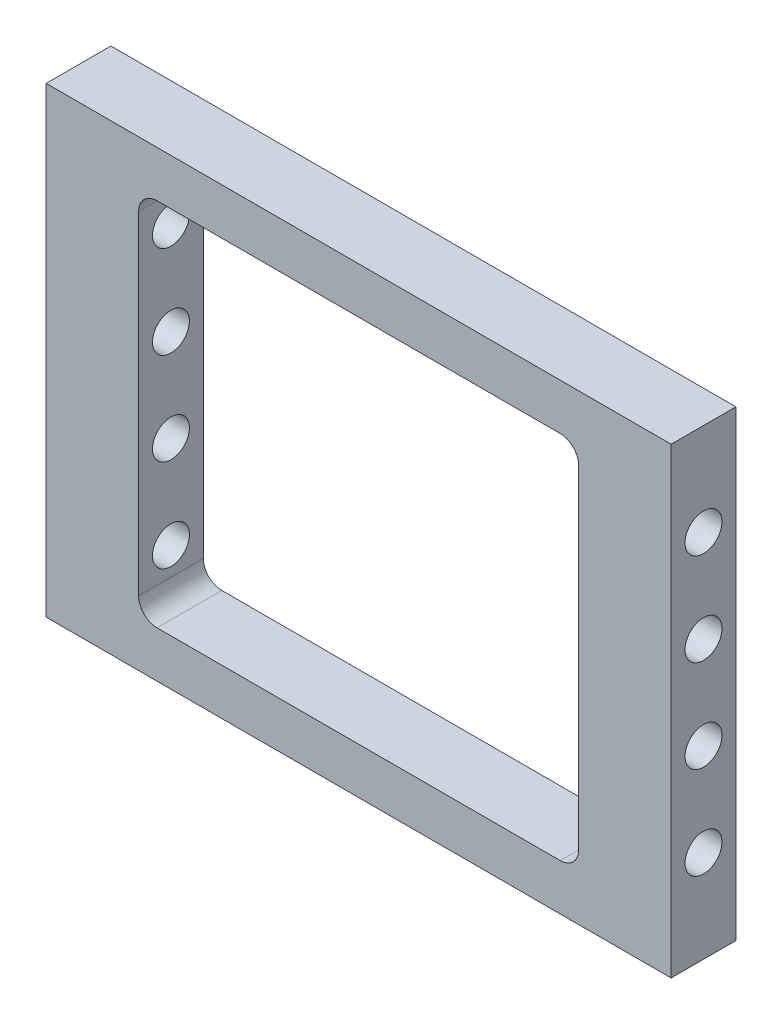
ISO-10303-21;
HEADER;
FILE_DESCRIPTION(('STEP AP214'),'2;1');
FILE_NAME('part.step','',(''),(''),'','','');
FILE_SCHEMA(('AUTOMOTIVE_DESIGN { 1 0 10303 214 1 1 1 1 }'));
ENDSEC;
DATA;
#1=APPLICATION_CONTEXT('core data for automotive mechanical design processes');
#2=APPLICATION_PROTOCOL_DEFINITION('international standard','automotive_design',2000,#1);
#3=PRODUCT_CONTEXT('',#1,'mechanical');
#4=PRODUCT('Part','Part','',(#3));
#5=PRODUCT_RELATED_PRODUCT_CATEGORY('part','',(#4));
#6=PRODUCT_DEFINITION_FORMATION('','',#4);
#7=PRODUCT_DEFINITION_CONTEXT('part definition',#1,'design');
#8=PRODUCT_DEFINITION('design','',#6,#7);
#9=PRODUCT_DEFINITION_SHAPE('','',#8);
#10=(LENGTH_UNIT() NAMED_UNIT(*) SI_UNIT(.MILLI.,.METRE.));
#11=(NAMED_UNIT(*) PLANE_ANGLE_UNIT() SI_UNIT($,.RADIAN.));
#12=(NAMED_UNIT(*) SI_UNIT($,.STERADIAN.) SOLID_ANGLE_UNIT());
#13=UNCERTAINTY_MEASURE_WITH_UNIT(LENGTH_MEASURE(1.E-05),#10,'distance_accuracy_value','');
#14=(GEOMETRIC_REPRESENTATION_CONTEXT(3) GLOBAL_UNCERTAINTY_ASSIGNED_CONTEXT((#13)) GLOBAL_UNIT_ASSIGNED_CONTEXT((#10,
#11,#12)) REPRESENTATION_CONTEXT('',''));
#15=CARTESIAN_POINT('',(0.,0.,0.));
#16=DIRECTION('',(0.,0.,1.));
#17=DIRECTION('',(1.,0.,0.));
#18=AXIS2_PLACEMENT_3D('',#15,#16,#17);
#19=CARTESIAN_POINT('',(0.,0.,7.));
#20=DIRECTION('',(1.,0.,0.));
#21=DIRECTION('',(0.,0.,-1.));
#22=AXIS2_PLACEMENT_3D('',#19,#20,#21);
#23=PLANE('',#22);
#24=CARTESIAN_POINT('',(0.,30.,3.5));
#25=DIRECTION('',(-1.,0.,0.));
#26=DIRECTION('',(0.,0.,1.));
#27=AXIS2_PLACEMENT_3D('',#24,#25,#26);
#28=CIRCLE('',#27,2.);
#29=CARTESIAN_POINT('',(0.,30.,5.5));
#30=VERTEX_POINT('',#29);
#31=EDGE_CURVE('E256',#30,#30,#28,.T.);
#32=ORIENTED_EDGE('',*,*,#31,.F.);
#33=EDGE_LOOP('',(#32));
#34=FACE_BOUND('',#33,.T.);
#35=CARTESIAN_POINT('',(0.,20.,3.5));
#36=DIRECTION('',(-1.,0.,0.));
#37=DIRECTION('',(0.,0.,1.));
#38=AXIS2_PLACEMENT_3D('',#35,#36,#37);
#39=CIRCLE('',#38,2.);
#40=CARTESIAN_POINT('',(0.,20.,5.5));
#41=VERTEX_POINT('',#40);
#42=EDGE_CURVE('E260',#41,#41,#39,.T.);
#43=ORIENTED_EDGE('',*,*,#42,.F.);
#44=EDGE_LOOP('',(#43));
#45=FACE_BOUND('',#44,.T.);
#46=CARTESIAN_POINT('',(0.,10.,3.5));
#47=DIRECTION('',(-1.,0.,0.));
#48=DIRECTION('',(0.,0.,1.));
#49=AXIS2_PLACEMENT_3D('',#46,#47,#48);
#50=CIRCLE('',#49,2.);
#51=CARTESIAN_POINT('',(0.,10.,5.5));
#52=VERTEX_POINT('',#51);
#53=EDGE_CURVE('E255',#52,#52,#50,.T.);
#54=ORIENTED_EDGE('',*,*,#53,.F.);
#55=EDGE_LOOP('',(#54));
#56=FACE_BOUND('',#55,.T.);
#57=CARTESIAN_POINT('',(0.,40.,3.5));
#58=DIRECTION('',(-1.,0.,0.));
#59=DIRECTION('',(0.,0.,1.));
#60=AXIS2_PLACEMENT_3D('',#57,#58,#59);
#61=CIRCLE('',#60,2.);
#62=CARTESIAN_POINT('',(0.,40.,5.5));
#63=VERTEX_POINT('',#62);
#64=EDGE_CURVE('E259',#63,#63,#61,.T.);
#65=ORIENTED_EDGE('',*,*,#64,.F.);
#66=EDGE_LOOP('',(#65));
#67=FACE_BOUND('',#66,.T.);
#68=DIRECTION('',(0.,-1.,0.));
#69=VECTOR('',#68,1.);
#70=CARTESIAN_POINT('',(0.,0.,0.));
#71=LINE('',#70,#69);
#72=CARTESIAN_POINT('',(0.,50.,0.));
#73=VERTEX_POINT('',#72);
#74=CARTESIAN_POINT('',(0.,0.,0.));
#75=VERTEX_POINT('',#74);
#76=EDGE_CURVE('E147',#73,#75,#71,.T.);
#77=ORIENTED_EDGE('',*,*,#76,.T.);
#78=DIRECTION('',(0.,0.,-1.));
#79=VECTOR('',#78,1.);
#80=CARTESIAN_POINT('',(0.,0.,7.));
#81=LINE('',#80,#79);
#82=CARTESIAN_POINT('',(0.,0.,7.));
#83=VERTEX_POINT('',#82);
#84=EDGE_CURVE('E128',#83,#75,#81,.T.);
#85=ORIENTED_EDGE('',*,*,#84,.F.);
#86=DIRECTION('',(0.,-1.,0.));
#87=VECTOR('',#86,1.);
#88=CARTESIAN_POINT('',(0.,0.,7.));
#89=LINE('',#88,#87);
#90=CARTESIAN_POINT('',(0.,50.,7.));
#91=VERTEX_POINT('',#90);
#92=EDGE_CURVE('E135',#91,#83,#89,.T.);
#93=ORIENTED_EDGE('',*,*,#92,.F.);
#94=DIRECTION('',(0.,0.,-1.));
#95=VECTOR('',#94,1.);
#96=CARTESIAN_POINT('',(0.,50.,7.));
#97=LINE('',#96,#95);
#98=EDGE_CURVE('E269',#91,#73,#97,.T.);
#99=ORIENTED_EDGE('',*,*,#98,.T.);
#100=EDGE_LOOP('',(#77,#85,#93,#99));
#101=FACE_BOUND('',#100,.T.);
#102=ADVANCED_FACE('F35',(#34,#45,#56,#67,#101),#23,.F.);
#103=CARTESIAN_POINT('',(0.,0.,7.));
#104=DIRECTION('',(0.,1.,0.));
#105=DIRECTION('',(0.,0.,1.));
#106=AXIS2_PLACEMENT_3D('',#103,#104,#105);
#107=PLANE('',#106);
#108=DIRECTION('',(1.,0.,0.));
#109=VECTOR('',#108,1.);
#110=CARTESIAN_POINT('',(0.,0.,0.));
#111=LINE('',#110,#109);
#112=CARTESIAN_POINT('',(67.6,0.,0.));
#113=VERTEX_POINT('',#112);
#114=EDGE_CURVE('E271',#75,#113,#111,.T.);
#115=ORIENTED_EDGE('',*,*,#114,.T.);
#116=DIRECTION('',(0.,0.,-1.));
#117=VECTOR('',#116,1.);
#118=CARTESIAN_POINT('',(67.6,0.,7.));
#119=LINE('',#118,#117);
#120=CARTESIAN_POINT('',(67.6,0.,7.));
#121=VERTEX_POINT('',#120);
#122=EDGE_CURVE('E131',#121,#113,#119,.T.);
#123=ORIENTED_EDGE('',*,*,#122,.F.);
#124=DIRECTION('',(1.,0.,0.));
#125=VECTOR('',#124,1.);
#126=CARTESIAN_POINT('',(0.,0.,7.));
#127=LINE('',#126,#125);
#128=EDGE_CURVE('E124',#83,#121,#127,.T.);
#129=ORIENTED_EDGE('',*,*,#128,.F.);
#130=ORIENTED_EDGE('',*,*,#84,.T.);
#131=EDGE_LOOP('',(#115,#123,#129,#130));
#132=FACE_BOUND('',#131,.T.);
#133=ADVANCED_FACE('F126',(#132),#107,.F.);
#134=CARTESIAN_POINT('',(67.6,0.,7.));
#135=DIRECTION('',(-1.,0.,0.));
#136=DIRECTION('',(0.,0.,1.));
#137=AXIS2_PLACEMENT_3D('',#134,#135,#136);
#138=PLANE('',#137);
#139=CARTESIAN_POINT('',(67.6,30.,3.5));
#140=DIRECTION('',(-1.,0.,0.));
#141=DIRECTION('',(0.,0.,1.));
#142=AXIS2_PLACEMENT_3D('',#139,#140,#141);
#143=CIRCLE('',#142,2.);
#144=CARTESIAN_POINT('',(67.6,30.,5.5));
#145=VERTEX_POINT('',#144);
#146=EDGE_CURVE('E244',#145,#145,#143,.T.);
#147=ORIENTED_EDGE('',*,*,#146,.T.);
#148=EDGE_LOOP('',(#147));
#149=FACE_BOUND('',#148,.T.);
#150=CARTESIAN_POINT('',(67.6,20.,3.5));
#151=DIRECTION('',(-1.,0.,0.));
#152=DIRECTION('',(0.,0.,1.));
#153=AXIS2_PLACEMENT_3D('',#150,#151,#152);
#154=CIRCLE('',#153,2.);
#155=CARTESIAN_POINT('',(67.6,20.,5.5));
#156=VERTEX_POINT('',#155);
#157=EDGE_CURVE('E248',#156,#156,#154,.T.);
#158=ORIENTED_EDGE('',*,*,#157,.T.);
#159=EDGE_LOOP('',(#158));
#160=FACE_BOUND('',#159,.T.);
#161=CARTESIAN_POINT('',(67.6,10.,3.5));
#162=DIRECTION('',(-1.,0.,0.));
#163=DIRECTION('',(0.,0.,1.));
#164=AXIS2_PLACEMENT_3D('',#161,#162,#163);
#165=CIRCLE('',#164,2.);
#166=CARTESIAN_POINT('',(67.6,10.,5.5));
#167=VERTEX_POINT('',#166);
#168=EDGE_CURVE('E243',#167,#167,#165,.T.);
#169=ORIENTED_EDGE('',*,*,#168,.T.);
#170=EDGE_LOOP('',(#169));
#171=FACE_BOUND('',#170,.T.);
#172=CARTESIAN_POINT('',(67.6,40.,3.5));
#173=DIRECTION('',(-1.,0.,0.));
#174=DIRECTION('',(0.,0.,1.));
#175=AXIS2_PLACEMENT_3D('',#172,#173,#174);
#176=CIRCLE('',#175,2.);
#177=CARTESIAN_POINT('',(67.6,40.,5.5));
#178=VERTEX_POINT('',#177);
#179=EDGE_CURVE('E247',#178,#178,#176,.T.);
#180=ORIENTED_EDGE('',*,*,#179,.T.);
#181=EDGE_LOOP('',(#180));
#182=FACE_BOUND('',#181,.T.);
#183=DIRECTION('',(0.,1.,0.));
#184=VECTOR('',#183,1.);
#185=CARTESIAN_POINT('',(67.6,0.,0.));
#186=LINE('',#185,#184);
#187=CARTESIAN_POINT('',(67.6,50.,0.));
#188=VERTEX_POINT('',#187);
#189=EDGE_CURVE('E273',#113,#188,#186,.T.);
#190=ORIENTED_EDGE('',*,*,#189,.T.);
#191=DIRECTION('',(0.,0.,-1.));
#192=VECTOR('',#191,1.);
#193=CARTESIAN_POINT('',(67.6,50.,7.));
#194=LINE('',#193,#192);
#195=CARTESIAN_POINT('',(67.6,50.,7.));
#196=VERTEX_POINT('',#195);
#197=EDGE_CURVE('E152',#196,#188,#194,.T.);
#198=ORIENTED_EDGE('',*,*,#197,.F.);
#199=DIRECTION('',(0.,1.,0.));
#200=VECTOR('',#199,1.);
#201=CARTESIAN_POINT('',(67.6,0.,7.));
#202=LINE('',#201,#200);
#203=EDGE_CURVE('E134',#121,#196,#202,.T.);
#204=ORIENTED_EDGE('',*,*,#203,.F.);
#205=ORIENTED_EDGE('',*,*,#122,.T.);
#206=EDGE_LOOP('',(#190,#198,#204,#205));
#207=FACE_BOUND('',#206,.T.);
#208=ADVANCED_FACE('F285',(#149,#160,#171,#182,#207),#138,.F.);
#209=CARTESIAN_POINT('',(0.,50.,7.));
#210=DIRECTION('',(0.,-1.,0.));
#211=DIRECTION('',(0.,0.,-1.));
#212=AXIS2_PLACEMENT_3D('',#209,#210,#211);
#213=PLANE('',#212);
#214=DIRECTION('',(-1.,0.,0.));
#215=VECTOR('',#214,1.);
#216=CARTESIAN_POINT('',(0.,50.,0.));
#217=LINE('',#216,#215);
#218=EDGE_CURVE('E144',#188,#73,#217,.T.);
#219=ORIENTED_EDGE('',*,*,#218,.T.);
#220=ORIENTED_EDGE('',*,*,#98,.F.);
#221=DIRECTION('',(-1.,0.,0.));
#222=VECTOR('',#221,1.);
#223=CARTESIAN_POINT('',(0.,50.,7.));
#224=LINE('',#223,#222);
#225=EDGE_CURVE('E140',#196,#91,#224,.T.);
#226=ORIENTED_EDGE('',*,*,#225,.F.);
#227=ORIENTED_EDGE('',*,*,#197,.T.);
#228=EDGE_LOOP('',(#219,#220,#226,#227));
#229=FACE_BOUND('',#228,.T.);
#230=ADVANCED_FACE('F280',(#229),#213,.F.);
#231=CARTESIAN_POINT('',(0.,0.,7.));
#232=DIRECTION('',(0.,0.,-1.));
#233=DIRECTION('',(-1.,0.,0.));
#234=AXIS2_PLACEMENT_3D('',#231,#232,#233);
#235=PLANE('',#234);
#236=DIRECTION('',(1.,0.,0.));
#237=VECTOR('',#236,1.);
#238=CARTESIAN_POINT('',(10.,5.,7.));
#239=LINE('',#238,#237);
#240=CARTESIAN_POINT('',(12.,5.,7.));
#241=VERTEX_POINT('',#240);
#242=CARTESIAN_POINT('',(55.6,5.,7.));
#243=VERTEX_POINT('',#242);
#244=EDGE_CURVE('E215',#241,#243,#239,.T.);
#245=ORIENTED_EDGE('',*,*,#244,.F.);
#246=CARTESIAN_POINT('',(12.,7.,7.));
#247=DIRECTION('',(0.,0.,-1.));
#248=DIRECTION('',(-1.,0.,0.));
#249=AXIS2_PLACEMENT_3D('',#246,#247,#248);
#250=CIRCLE('',#249,2.);
#251=CARTESIAN_POINT('',(10.,7.00000000000001,7.));
#252=VERTEX_POINT('',#251);
#253=EDGE_CURVE('E180',#241,#252,#250,.T.);
#254=ORIENTED_EDGE('',*,*,#253,.T.);
#255=DIRECTION('',(0.,-1.,0.));
#256=VECTOR('',#255,1.);
#257=CARTESIAN_POINT('',(10.,45.,7.));
#258=LINE('',#257,#256);
#259=CARTESIAN_POINT('',(10.,43.,7.));
#260=VERTEX_POINT('',#259);
#261=EDGE_CURVE('E189',#260,#252,#258,.T.);
#262=ORIENTED_EDGE('',*,*,#261,.F.);
#263=CARTESIAN_POINT('',(12.,43.,7.));
#264=DIRECTION('',(0.,0.,-1.));
#265=DIRECTION('',(-1.,0.,0.));
#266=AXIS2_PLACEMENT_3D('',#263,#264,#265);
#267=CIRCLE('',#266,2.);
#268=CARTESIAN_POINT('',(12.,45.,7.));
#269=VERTEX_POINT('',#268);
#270=EDGE_CURVE('E43',#260,#269,#267,.T.);
#271=ORIENTED_EDGE('',*,*,#270,.T.);
#272=DIRECTION('',(-1.,0.,0.));
#273=VECTOR('',#272,1.);
#274=CARTESIAN_POINT('',(10.,45.,7.));
#275=LINE('',#274,#273);
#276=CARTESIAN_POINT('',(55.6,45.,7.));
#277=VERTEX_POINT('',#276);
#278=EDGE_CURVE('E188',#277,#269,#275,.T.);
#279=ORIENTED_EDGE('',*,*,#278,.F.);
#280=CARTESIAN_POINT('',(55.6,43.,7.));
#281=DIRECTION('',(0.,0.,-1.));
#282=DIRECTION('',(-1.,0.,0.));
#283=AXIS2_PLACEMENT_3D('',#280,#281,#282);
#284=CIRCLE('',#283,2.);
#285=CARTESIAN_POINT('',(57.6,43.,7.));
#286=VERTEX_POINT('',#285);
#287=EDGE_CURVE('E176',#277,#286,#284,.T.);
#288=ORIENTED_EDGE('',*,*,#287,.T.);
#289=DIRECTION('',(0.,1.,0.));
#290=VECTOR('',#289,1.);
#291=CARTESIAN_POINT('',(57.6,45.,7.));
#292=LINE('',#291,#290);
#293=CARTESIAN_POINT('',(57.6,7.00000000000001,7.));
#294=VERTEX_POINT('',#293);
#295=EDGE_CURVE('E198',#294,#286,#292,.T.);
#296=ORIENTED_EDGE('',*,*,#295,.F.);
#297=CARTESIAN_POINT('',(55.6,7.00000000000001,7.));
#298=DIRECTION('',(0.,0.,-1.));
#299=DIRECTION('',(-1.,0.,0.));
#300=AXIS2_PLACEMENT_3D('',#297,#298,#299);
#301=CIRCLE('',#300,2.);
#302=EDGE_CURVE('E172',#294,#243,#301,.T.);
#303=ORIENTED_EDGE('',*,*,#302,.T.);
#304=EDGE_LOOP('',(#245,#254,#262,#271,#279,#288,#296,#303));
#305=FACE_BOUND('',#304,.T.);
#306=ORIENTED_EDGE('',*,*,#92,.T.);
#307=ORIENTED_EDGE('',*,*,#128,.T.);
#308=ORIENTED_EDGE('',*,*,#203,.T.);
#309=ORIENTED_EDGE('',*,*,#225,.T.);
#310=EDGE_LOOP('',(#306,#307,#308,#309));
#311=FACE_BOUND('',#310,.T.);
#312=ADVANCED_FACE('F138',(#305,#311),#235,.F.);
#313=CARTESIAN_POINT('',(0.,0.,0.));
#314=DIRECTION('',(0.,0.,-1.));
#315=DIRECTION('',(-1.,0.,0.));
#316=AXIS2_PLACEMENT_3D('',#313,#314,#315);
#317=PLANE('',#316);
#318=DIRECTION('',(-1.,0.,0.));
#319=VECTOR('',#318,1.);
#320=CARTESIAN_POINT('',(10.,45.,0.));
#321=LINE('',#320,#319);
#322=CARTESIAN_POINT('',(55.6,45.,0.));
#323=VERTEX_POINT('',#322);
#324=CARTESIAN_POINT('',(12.,45.,0.));
#325=VERTEX_POINT('',#324);
#326=EDGE_CURVE('E211',#323,#325,#321,.T.);
#327=ORIENTED_EDGE('',*,*,#326,.T.);
#328=CARTESIAN_POINT('',(12.,43.,0.));
#329=DIRECTION('',(0.,0.,-1.));
#330=DIRECTION('',(-1.,0.,0.));
#331=AXIS2_PLACEMENT_3D('',#328,#329,#330);
#332=CIRCLE('',#331,2.);
#333=CARTESIAN_POINT('',(10.,43.,0.));
#334=VERTEX_POINT('',#333);
#335=EDGE_CURVE('E11',#325,#334,#332,.F.);
#336=ORIENTED_EDGE('',*,*,#335,.T.);
#337=DIRECTION('',(0.,-1.,0.));
#338=VECTOR('',#337,1.);
#339=CARTESIAN_POINT('',(10.,45.,0.));
#340=LINE('',#339,#338);
#341=CARTESIAN_POINT('',(10.,7.00000000000001,0.));
#342=VERTEX_POINT('',#341);
#343=EDGE_CURVE('E197',#334,#342,#340,.T.);
#344=ORIENTED_EDGE('',*,*,#343,.T.);
#345=CARTESIAN_POINT('',(12.,7.,0.));
#346=DIRECTION('',(0.,0.,-1.));
#347=DIRECTION('',(-1.,0.,0.));
#348=AXIS2_PLACEMENT_3D('',#345,#346,#347);
#349=CIRCLE('',#348,2.);
#350=CARTESIAN_POINT('',(12.,5.,0.));
#351=VERTEX_POINT('',#350);
#352=EDGE_CURVE('E182',#342,#351,#349,.F.);
#353=ORIENTED_EDGE('',*,*,#352,.T.);
#354=DIRECTION('',(1.,0.,0.));
#355=VECTOR('',#354,1.);
#356=CARTESIAN_POINT('',(10.,5.,0.));
#357=LINE('',#356,#355);
#358=CARTESIAN_POINT('',(55.6,5.,0.));
#359=VERTEX_POINT('',#358);
#360=EDGE_CURVE('E203',#351,#359,#357,.T.);
#361=ORIENTED_EDGE('',*,*,#360,.T.);
#362=CARTESIAN_POINT('',(55.6,7.00000000000001,0.));
#363=DIRECTION('',(0.,0.,-1.));
#364=DIRECTION('',(-1.,0.,0.));
#365=AXIS2_PLACEMENT_3D('',#362,#363,#364);
#366=CIRCLE('',#365,2.);
#367=CARTESIAN_POINT('',(57.6,7.00000000000001,0.));
#368=VERTEX_POINT('',#367);
#369=EDGE_CURVE('E174',#359,#368,#366,.F.);
#370=ORIENTED_EDGE('',*,*,#369,.T.);
#371=DIRECTION('',(0.,1.,0.));
#372=VECTOR('',#371,1.);
#373=CARTESIAN_POINT('',(57.6,45.,0.));
#374=LINE('',#373,#372);
#375=CARTESIAN_POINT('',(57.6,43.,0.));
#376=VERTEX_POINT('',#375);
#377=EDGE_CURVE('E206',#368,#376,#374,.T.);
#378=ORIENTED_EDGE('',*,*,#377,.T.);
#379=CARTESIAN_POINT('',(55.6,43.,0.));
#380=DIRECTION('',(0.,0.,-1.));
#381=DIRECTION('',(-1.,0.,0.));
#382=AXIS2_PLACEMENT_3D('',#379,#380,#381);
#383=CIRCLE('',#382,2.);
#384=EDGE_CURVE('E178',#376,#323,#383,.F.);
#385=ORIENTED_EDGE('',*,*,#384,.T.);
#386=EDGE_LOOP('',(#327,#336,#344,#353,#361,#370,#378,#385));
#387=FACE_BOUND('',#386,.T.);
#388=ORIENTED_EDGE('',*,*,#76,.F.);
#389=ORIENTED_EDGE('',*,*,#218,.F.);
#390=ORIENTED_EDGE('',*,*,#189,.F.);
#391=ORIENTED_EDGE('',*,*,#114,.F.);
#392=EDGE_LOOP('',(#388,#389,#390,#391));
#393=FACE_BOUND('',#392,.T.);
#394=ADVANCED_FACE('F284',(#387,#393),#317,.T.);
#395=CARTESIAN_POINT('',(10.,40.,3.5));
#396=DIRECTION('',(-1.,0.,0.));
#397=DIRECTION('',(0.,0.,1.));
#398=AXIS2_PLACEMENT_3D('',#395,#396,#397);
#399=CYLINDRICAL_SURFACE('',#398,2.);
#400=CARTESIAN_POINT('',(10.,40.,3.5));
#401=DIRECTION('',(-1.,0.,0.));
#402=DIRECTION('',(0.,-1.,0.));
#403=AXIS2_PLACEMENT_3D('',#400,#401,#402);
#404=CIRCLE('',#403,2.);
#405=CARTESIAN_POINT('',(10.,38.,3.5));
#406=VERTEX_POINT('',#405);
#407=EDGE_CURVE('E240',#406,#406,#404,.F.);
#408=ORIENTED_EDGE('',*,*,#407,.T.);
#409=EDGE_LOOP('',(#408));
#410=FACE_BOUND('',#409,.T.);
#411=ORIENTED_EDGE('',*,*,#64,.T.);
#412=EDGE_LOOP('',(#411));
#413=FACE_BOUND('',#412,.T.);
#414=ADVANCED_FACE('F371',(#410,#413),#399,.F.);
#415=CARTESIAN_POINT('',(10.,10.,3.5));
#416=DIRECTION('',(-1.,0.,0.));
#417=DIRECTION('',(0.,0.,1.));
#418=AXIS2_PLACEMENT_3D('',#415,#416,#417);
#419=CYLINDRICAL_SURFACE('',#418,2.);
#420=CARTESIAN_POINT('',(10.,10.,3.5));
#421=DIRECTION('',(-1.,0.,0.));
#422=DIRECTION('',(0.,-1.,0.));
#423=AXIS2_PLACEMENT_3D('',#420,#421,#422);
#424=CIRCLE('',#423,2.);
#425=CARTESIAN_POINT('',(10.,8.,3.5));
#426=VERTEX_POINT('',#425);
#427=EDGE_CURVE('E237',#426,#426,#424,.F.);
#428=ORIENTED_EDGE('',*,*,#427,.T.);
#429=EDGE_LOOP('',(#428));
#430=FACE_BOUND('',#429,.T.);
#431=ORIENTED_EDGE('',*,*,#53,.T.);
#432=EDGE_LOOP('',(#431));
#433=FACE_BOUND('',#432,.T.);
#434=ADVANCED_FACE('F367',(#430,#433),#419,.F.);
#435=CARTESIAN_POINT('',(10.,20.,3.5));
#436=DIRECTION('',(-1.,0.,0.));
#437=DIRECTION('',(0.,0.,1.));
#438=AXIS2_PLACEMENT_3D('',#435,#436,#437);
#439=CYLINDRICAL_SURFACE('',#438,2.);
#440=CARTESIAN_POINT('',(10.,20.,3.5));
#441=DIRECTION('',(-1.,0.,0.));
#442=DIRECTION('',(0.,-1.,0.));
#443=AXIS2_PLACEMENT_3D('',#440,#441,#442);
#444=CIRCLE('',#443,2.);
#445=CARTESIAN_POINT('',(10.,18.,3.5));
#446=VERTEX_POINT('',#445);
#447=EDGE_CURVE('E234',#446,#446,#444,.F.);
#448=ORIENTED_EDGE('',*,*,#447,.T.);
#449=EDGE_LOOP('',(#448));
#450=FACE_BOUND('',#449,.T.);
#451=ORIENTED_EDGE('',*,*,#42,.T.);
#452=EDGE_LOOP('',(#451));
#453=FACE_BOUND('',#452,.T.);
#454=ADVANCED_FACE('F363',(#450,#453),#439,.F.);
#455=CARTESIAN_POINT('',(10.,30.,3.5));
#456=DIRECTION('',(-1.,0.,0.));
#457=DIRECTION('',(0.,0.,1.));
#458=AXIS2_PLACEMENT_3D('',#455,#456,#457);
#459=CYLINDRICAL_SURFACE('',#458,2.);
#460=CARTESIAN_POINT('',(10.,30.,3.5));
#461=DIRECTION('',(-1.,0.,0.));
#462=DIRECTION('',(0.,-1.,0.));
#463=AXIS2_PLACEMENT_3D('',#460,#461,#462);
#464=CIRCLE('',#463,2.);
#465=CARTESIAN_POINT('',(10.,28.,3.5));
#466=VERTEX_POINT('',#465);
#467=EDGE_CURVE('E231',#466,#466,#464,.F.);
#468=ORIENTED_EDGE('',*,*,#467,.T.);
#469=EDGE_LOOP('',(#468));
#470=FACE_BOUND('',#469,.T.);
#471=ORIENTED_EDGE('',*,*,#31,.T.);
#472=EDGE_LOOP('',(#471));
#473=FACE_BOUND('',#472,.T.);
#474=ADVANCED_FACE('F359',(#470,#473),#459,.F.);
#475=CARTESIAN_POINT('',(57.6,40.,3.5));
#476=DIRECTION('',(1.,0.,0.));
#477=DIRECTION('',(0.,0.,-1.));
#478=AXIS2_PLACEMENT_3D('',#475,#476,#477);
#479=CYLINDRICAL_SURFACE('',#478,2.);
#480=CARTESIAN_POINT('',(57.6,40.,3.5));
#481=DIRECTION('',(1.,0.,0.));
#482=DIRECTION('',(0.,1.,0.));
#483=AXIS2_PLACEMENT_3D('',#480,#481,#482);
#484=CIRCLE('',#483,2.);
#485=CARTESIAN_POINT('',(57.6,42.,3.5));
#486=VERTEX_POINT('',#485);
#487=EDGE_CURVE('E228',#486,#486,#484,.T.);
#488=ORIENTED_EDGE('',*,*,#487,.F.);
#489=EDGE_LOOP('',(#488));
#490=FACE_BOUND('',#489,.T.);
#491=ORIENTED_EDGE('',*,*,#179,.F.);
#492=EDGE_LOOP('',(#491));
#493=FACE_BOUND('',#492,.T.);
#494=ADVANCED_FACE('F355',(#490,#493),#479,.F.);
#495=CARTESIAN_POINT('',(57.6,10.,3.5));
#496=DIRECTION('',(1.,0.,0.));
#497=DIRECTION('',(0.,0.,-1.));
#498=AXIS2_PLACEMENT_3D('',#495,#496,#497);
#499=CYLINDRICAL_SURFACE('',#498,2.);
#500=CARTESIAN_POINT('',(57.6,10.,3.5));
#501=DIRECTION('',(1.,0.,0.));
#502=DIRECTION('',(0.,1.,0.));
#503=AXIS2_PLACEMENT_3D('',#500,#501,#502);
#504=CIRCLE('',#503,2.);
#505=CARTESIAN_POINT('',(57.6,12.,3.5));
#506=VERTEX_POINT('',#505);
#507=EDGE_CURVE('E225',#506,#506,#504,.T.);
#508=ORIENTED_EDGE('',*,*,#507,.F.);
#509=EDGE_LOOP('',(#508));
#510=FACE_BOUND('',#509,.T.);
#511=ORIENTED_EDGE('',*,*,#168,.F.);
#512=EDGE_LOOP('',(#511));
#513=FACE_BOUND('',#512,.T.);
#514=ADVANCED_FACE('F351',(#510,#513),#499,.F.);
#515=CARTESIAN_POINT('',(57.6,20.,3.5));
#516=DIRECTION('',(1.,0.,0.));
#517=DIRECTION('',(0.,0.,-1.));
#518=AXIS2_PLACEMENT_3D('',#515,#516,#517);
#519=CYLINDRICAL_SURFACE('',#518,2.);
#520=CARTESIAN_POINT('',(57.6,20.,3.5));
#521=DIRECTION('',(1.,0.,0.));
#522=DIRECTION('',(0.,1.,0.));
#523=AXIS2_PLACEMENT_3D('',#520,#521,#522);
#524=CIRCLE('',#523,2.);
#525=CARTESIAN_POINT('',(57.6,22.,3.5));
#526=VERTEX_POINT('',#525);
#527=EDGE_CURVE('E222',#526,#526,#524,.T.);
#528=ORIENTED_EDGE('',*,*,#527,.F.);
#529=EDGE_LOOP('',(#528));
#530=FACE_BOUND('',#529,.T.);
#531=ORIENTED_EDGE('',*,*,#157,.F.);
#532=EDGE_LOOP('',(#531));
#533=FACE_BOUND('',#532,.T.);
#534=ADVANCED_FACE('F347',(#530,#533),#519,.F.);
#535=CARTESIAN_POINT('',(57.6,30.,3.5));
#536=DIRECTION('',(1.,0.,0.));
#537=DIRECTION('',(0.,0.,-1.));
#538=AXIS2_PLACEMENT_3D('',#535,#536,#537);
#539=CYLINDRICAL_SURFACE('',#538,2.);
#540=CARTESIAN_POINT('',(57.6,30.,3.5));
#541=DIRECTION('',(1.,0.,0.));
#542=DIRECTION('',(0.,1.,0.));
#543=AXIS2_PLACEMENT_3D('',#540,#541,#542);
#544=CIRCLE('',#543,2.);
#545=CARTESIAN_POINT('',(57.6,32.,3.5));
#546=VERTEX_POINT('',#545);
#547=EDGE_CURVE('E213',#546,#546,#544,.T.);
#548=ORIENTED_EDGE('',*,*,#547,.F.);
#549=EDGE_LOOP('',(#548));
#550=FACE_BOUND('',#549,.T.);
#551=ORIENTED_EDGE('',*,*,#146,.F.);
#552=EDGE_LOOP('',(#551));
#553=FACE_BOUND('',#552,.T.);
#554=ADVANCED_FACE('F343',(#550,#553),#539,.F.);
#555=CARTESIAN_POINT('',(10.,45.,0.));
#556=DIRECTION('',(-1.,0.,0.));
#557=DIRECTION('',(0.,-1.,0.));
#558=AXIS2_PLACEMENT_3D('',#555,#556,#557);
#559=PLANE('',#558);
#560=ORIENTED_EDGE('',*,*,#427,.F.);
#561=EDGE_LOOP('',(#560));
#562=FACE_BOUND('',#561,.T.);
#563=ORIENTED_EDGE('',*,*,#467,.F.);
#564=EDGE_LOOP('',(#563));
#565=FACE_BOUND('',#564,.T.);
#566=ORIENTED_EDGE('',*,*,#261,.T.);
#567=DIRECTION('',(0.,0.,1.));
#568=VECTOR('',#567,1.);
#569=CARTESIAN_POINT('',(10.,7.,0.));
#570=LINE('',#569,#568);
#571=EDGE_CURVE('E50',#252,#342,#570,.F.);
#572=ORIENTED_EDGE('',*,*,#571,.T.);
#573=ORIENTED_EDGE('',*,*,#343,.F.);
#574=DIRECTION('',(0.,0.,1.));
#575=VECTOR('',#574,1.);
#576=CARTESIAN_POINT('',(10.,43.,7.));
#577=LINE('',#576,#575);
#578=EDGE_CURVE('E168',#334,#260,#577,.T.);
#579=ORIENTED_EDGE('',*,*,#578,.T.);
#580=EDGE_LOOP('',(#566,#572,#573,#579));
#581=FACE_BOUND('',#580,.T.);
#582=ORIENTED_EDGE('',*,*,#447,.F.);
#583=EDGE_LOOP('',(#582));
#584=FACE_BOUND('',#583,.T.);
#585=ORIENTED_EDGE('',*,*,#407,.F.);
#586=EDGE_LOOP('',(#585));
#587=FACE_BOUND('',#586,.T.);
#588=ADVANCED_FACE('F200',(#562,#565,#581,#584,#587),#559,.F.);
#589=CARTESIAN_POINT('',(10.,45.,0.));
#590=DIRECTION('',(0.,1.,0.));
#591=DIRECTION('',(0.,0.,1.));
#592=AXIS2_PLACEMENT_3D('',#589,#590,#591);
#593=PLANE('',#592);
#594=ORIENTED_EDGE('',*,*,#326,.F.);
#595=DIRECTION('',(0.,0.,1.));
#596=VECTOR('',#595,1.);
#597=CARTESIAN_POINT('',(55.6,45.,7.));
#598=LINE('',#597,#596);
#599=EDGE_CURVE('E165',#323,#277,#598,.T.);
#600=ORIENTED_EDGE('',*,*,#599,.T.);
#601=ORIENTED_EDGE('',*,*,#278,.T.);
#602=DIRECTION('',(0.,0.,1.));
#603=VECTOR('',#602,1.);
#604=CARTESIAN_POINT('',(12.,45.,0.));
#605=LINE('',#604,#603);
#606=EDGE_CURVE('E163',#269,#325,#605,.F.);
#607=ORIENTED_EDGE('',*,*,#606,.T.);
#608=EDGE_LOOP('',(#594,#600,#601,#607));
#609=FACE_BOUND('',#608,.T.);
#610=ADVANCED_FACE('F195',(#609),#593,.F.);
#611=CARTESIAN_POINT('',(57.6,45.,0.));
#612=DIRECTION('',(1.,0.,0.));
#613=DIRECTION('',(0.,1.,0.));
#614=AXIS2_PLACEMENT_3D('',#611,#612,#613);
#615=PLANE('',#614);
#616=ORIENTED_EDGE('',*,*,#487,.T.);
#617=EDGE_LOOP('',(#616));
#618=FACE_BOUND('',#617,.T.);
#619=ORIENTED_EDGE('',*,*,#507,.T.);
#620=EDGE_LOOP('',(#619));
#621=FACE_BOUND('',#620,.T.);
#622=ORIENTED_EDGE('',*,*,#527,.T.);
#623=EDGE_LOOP('',(#622));
#624=FACE_BOUND('',#623,.T.);
#625=ORIENTED_EDGE('',*,*,#547,.T.);
#626=EDGE_LOOP('',(#625));
#627=FACE_BOUND('',#626,.T.);
#628=ORIENTED_EDGE('',*,*,#377,.F.);
#629=DIRECTION('',(0.,0.,1.));
#630=VECTOR('',#629,1.);
#631=CARTESIAN_POINT('',(57.6,7.00000000000001,7.));
#632=LINE('',#631,#630);
#633=EDGE_CURVE('E150',#368,#294,#632,.T.);
#634=ORIENTED_EDGE('',*,*,#633,.T.);
#635=ORIENTED_EDGE('',*,*,#295,.T.);
#636=DIRECTION('',(0.,0.,1.));
#637=VECTOR('',#636,1.);
#638=CARTESIAN_POINT('',(57.6,43.,0.));
#639=LINE('',#638,#637);
#640=EDGE_CURVE('E148',#286,#376,#639,.F.);
#641=ORIENTED_EDGE('',*,*,#640,.T.);
#642=EDGE_LOOP('',(#628,#634,#635,#641));
#643=FACE_BOUND('',#642,.T.);
#644=ADVANCED_FACE('F327',(#618,#621,#624,#627,#643),#615,.F.);
#645=CARTESIAN_POINT('',(10.,5.,0.));
#646=DIRECTION('',(0.,-1.,0.));
#647=DIRECTION('',(0.,0.,-1.));
#648=AXIS2_PLACEMENT_3D('',#645,#646,#647);
#649=PLANE('',#648);
#650=ORIENTED_EDGE('',*,*,#244,.T.);
#651=DIRECTION('',(0.,0.,1.));
#652=VECTOR('',#651,1.);
#653=CARTESIAN_POINT('',(55.6,5.,0.));
#654=LINE('',#653,#652);
#655=EDGE_CURVE('E161',#243,#359,#654,.F.);
#656=ORIENTED_EDGE('',*,*,#655,.T.);
#657=ORIENTED_EDGE('',*,*,#360,.F.);
#658=DIRECTION('',(0.,0.,1.));
#659=VECTOR('',#658,1.);
#660=CARTESIAN_POINT('',(12.,5.,7.));
#661=LINE('',#660,#659);
#662=EDGE_CURVE('E158',#351,#241,#661,.T.);
#663=ORIENTED_EDGE('',*,*,#662,.T.);
#664=EDGE_LOOP('',(#650,#656,#657,#663));
#665=FACE_BOUND('',#664,.T.);
#666=ADVANCED_FACE('F308',(#665),#649,.F.);
#667=CARTESIAN_POINT('',(55.6,7.00000000000001,0.));
#668=DIRECTION('',(0.,0.,-1.));
#669=DIRECTION('',(-1.,0.,0.));
#670=AXIS2_PLACEMENT_3D('',#667,#668,#669);
#671=CYLINDRICAL_SURFACE('',#670,2.);
#672=ORIENTED_EDGE('',*,*,#369,.F.);
#673=ORIENTED_EDGE('',*,*,#655,.F.);
#674=ORIENTED_EDGE('',*,*,#302,.F.);
#675=ORIENTED_EDGE('',*,*,#633,.F.);
#676=EDGE_LOOP('',(#672,#673,#674,#675));
#677=FACE_BOUND('',#676,.T.);
#678=ADVANCED_FACE('F304',(#677),#671,.F.);
#679=CARTESIAN_POINT('',(55.6,43.,0.));
#680=DIRECTION('',(0.,0.,-1.));
#681=DIRECTION('',(-1.,0.,0.));
#682=AXIS2_PLACEMENT_3D('',#679,#680,#681);
#683=CYLINDRICAL_SURFACE('',#682,2.);
#684=ORIENTED_EDGE('',*,*,#384,.F.);
#685=ORIENTED_EDGE('',*,*,#640,.F.);
#686=ORIENTED_EDGE('',*,*,#287,.F.);
#687=ORIENTED_EDGE('',*,*,#599,.F.);
#688=EDGE_LOOP('',(#684,#685,#686,#687));
#689=FACE_BOUND('',#688,.T.);
#690=ADVANCED_FACE('F307',(#689),#683,.F.);
#691=CARTESIAN_POINT('',(12.,7.,0.));
#692=DIRECTION('',(0.,0.,-1.));
#693=DIRECTION('',(-1.,0.,0.));
#694=AXIS2_PLACEMENT_3D('',#691,#692,#693);
#695=CYLINDRICAL_SURFACE('',#694,2.);
#696=ORIENTED_EDGE('',*,*,#352,.F.);
#697=ORIENTED_EDGE('',*,*,#571,.F.);
#698=ORIENTED_EDGE('',*,*,#253,.F.);
#699=ORIENTED_EDGE('',*,*,#662,.F.);
#700=EDGE_LOOP('',(#696,#697,#698,#699));
#701=FACE_BOUND('',#700,.T.);
#702=ADVANCED_FACE('F311',(#701),#695,.F.);
#703=CARTESIAN_POINT('',(12.,43.,0.));
#704=DIRECTION('',(0.,0.,-1.));
#705=DIRECTION('',(-1.,0.,0.));
#706=AXIS2_PLACEMENT_3D('',#703,#704,#705);
#707=CYLINDRICAL_SURFACE('',#706,2.);
#708=ORIENTED_EDGE('',*,*,#335,.F.);
#709=ORIENTED_EDGE('',*,*,#606,.F.);
#710=ORIENTED_EDGE('',*,*,#270,.F.);
#711=ORIENTED_EDGE('',*,*,#578,.F.);
#712=EDGE_LOOP('',(#708,#709,#710,#711));
#713=FACE_BOUND('',#712,.T.);
#714=ADVANCED_FACE('F37',(#713),#707,.F.);
#715=CLOSED_SHELL('',(#102,#133,#208,#230,#312,#394,#414,#434,#454,#474,#494,#514,#534,#554,
#588,#610,#644,#666,#678,#690,#702,#714));
#716=MANIFOLD_SOLID_BREP('B2',#715);
#717=ADVANCED_BREP_SHAPE_REPRESENTATION('',(#18,#716),#14);
#718=SHAPE_DEFINITION_REPRESENTATION(#9,#717);
ENDSEC;
END-ISO-10303-21;
